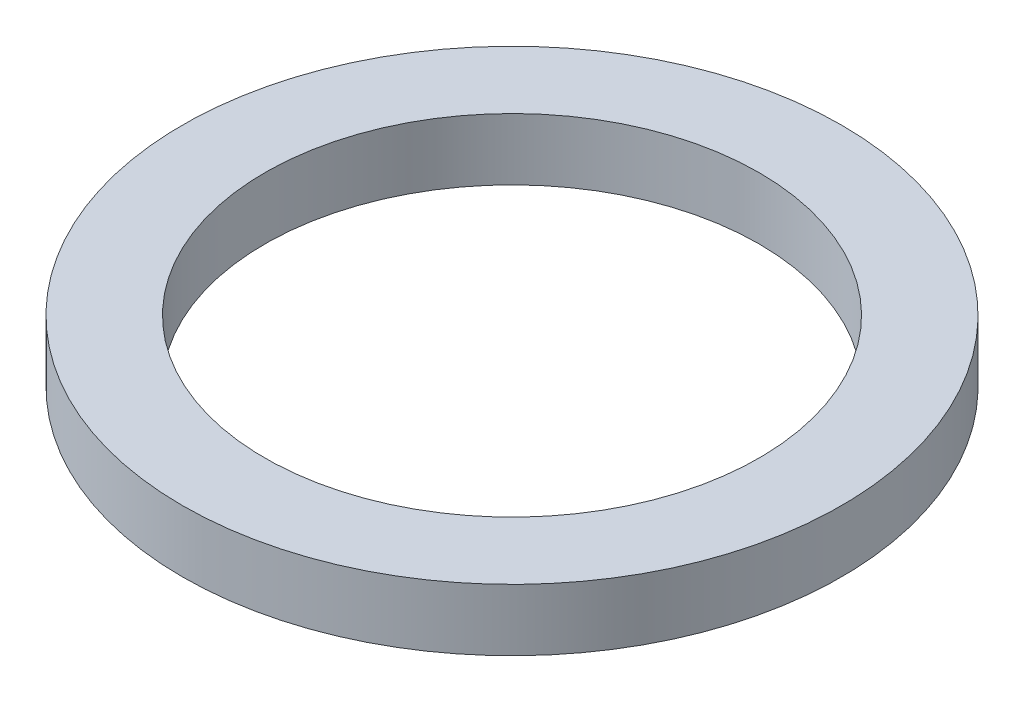
ISO-10303-21;
HEADER;
FILE_DESCRIPTION(('STEP AP214'),'2;1');
FILE_NAME('part.step','',(''),(''),'','','');
FILE_SCHEMA(('AUTOMOTIVE_DESIGN { 1 0 10303 214 1 1 1 1 }'));
ENDSEC;
DATA;
#1=APPLICATION_CONTEXT('core data for automotive mechanical design processes');
#2=APPLICATION_PROTOCOL_DEFINITION('international standard','automotive_design',2000,#1);
#3=PRODUCT_CONTEXT('',#1,'mechanical');
#4=PRODUCT('Part','Part','',(#3));
#5=PRODUCT_RELATED_PRODUCT_CATEGORY('part','',(#4));
#6=PRODUCT_DEFINITION_FORMATION('','',#4);
#7=PRODUCT_DEFINITION_CONTEXT('part definition',#1,'design');
#8=PRODUCT_DEFINITION('design','',#6,#7);
#9=PRODUCT_DEFINITION_SHAPE('','',#8);
#10=(LENGTH_UNIT() NAMED_UNIT(*) SI_UNIT(.MILLI.,.METRE.));
#11=(NAMED_UNIT(*) PLANE_ANGLE_UNIT() SI_UNIT($,.RADIAN.));
#12=(NAMED_UNIT(*) SI_UNIT($,.STERADIAN.) SOLID_ANGLE_UNIT());
#13=UNCERTAINTY_MEASURE_WITH_UNIT(LENGTH_MEASURE(1.E-05),#10,'distance_accuracy_value','');
#14=(GEOMETRIC_REPRESENTATION_CONTEXT(3) GLOBAL_UNCERTAINTY_ASSIGNED_CONTEXT((#13)) GLOBAL_UNIT_ASSIGNED_CONTEXT((#10,
#11,#12)) REPRESENTATION_CONTEXT('',''));
#15=CARTESIAN_POINT('',(0.,0.,0.));
#16=DIRECTION('',(0.,0.,1.));
#17=DIRECTION('',(1.,0.,0.));
#18=AXIS2_PLACEMENT_3D('',#15,#16,#17);
#19=CARTESIAN_POINT('',(-16.,0.,0.));
#20=DIRECTION('',(0.,-1.,0.));
#21=DIRECTION('',(0.,0.,-1.));
#22=AXIS2_PLACEMENT_3D('',#19,#20,#21);
#23=CYLINDRICAL_SURFACE('',#22,16.);
#24=CARTESIAN_POINT('',(-16.,3.,0.));
#25=DIRECTION('',(0.,-1.,0.));
#26=DIRECTION('',(0.,0.,-1.));
#27=AXIS2_PLACEMENT_3D('',#24,#25,#26);
#28=CIRCLE('',#27,16.);
#29=CARTESIAN_POINT('',(-16.,3.,-16.));
#30=VERTEX_POINT('',#29);
#31=EDGE_CURVE('E17',#30,#30,#28,.F.);
#32=ORIENTED_EDGE('',*,*,#31,.F.);
#33=EDGE_LOOP('',(#32));
#34=FACE_BOUND('',#33,.T.);
#35=CARTESIAN_POINT('',(-16.,0.,0.));
#36=DIRECTION('',(0.,-1.,0.));
#37=DIRECTION('',(0.,0.,-1.));
#38=AXIS2_PLACEMENT_3D('',#35,#36,#37);
#39=CIRCLE('',#38,16.);
#40=CARTESIAN_POINT('',(-16.,0.,-16.));
#41=VERTEX_POINT('',#40);
#42=EDGE_CURVE('E26',#41,#41,#39,.T.);
#43=ORIENTED_EDGE('',*,*,#42,.F.);
#44=EDGE_LOOP('',(#43));
#45=FACE_BOUND('',#44,.T.);
#46=ADVANCED_FACE('F14',(#34,#45),#23,.T.);
#47=CARTESIAN_POINT('',(-4.,3.,0.));
#48=DIRECTION('',(0.,-1.,0.));
#49=DIRECTION('',(0.,0.,-1.));
#50=AXIS2_PLACEMENT_3D('',#47,#48,#49);
#51=PLANE('',#50);
#52=CARTESIAN_POINT('',(-16.,3.,0.));
#53=DIRECTION('',(0.,-1.,0.));
#54=DIRECTION('',(0.,0.,-1.));
#55=AXIS2_PLACEMENT_3D('',#52,#53,#54);
#56=CIRCLE('',#55,12.);
#57=CARTESIAN_POINT('',(-16.,3.,-12.));
#58=VERTEX_POINT('',#57);
#59=EDGE_CURVE('E21',#58,#58,#56,.F.);
#60=ORIENTED_EDGE('',*,*,#59,.F.);
#61=EDGE_LOOP('',(#60));
#62=FACE_BOUND('',#61,.T.);
#63=ORIENTED_EDGE('',*,*,#31,.T.);
#64=EDGE_LOOP('',(#63));
#65=FACE_BOUND('',#64,.T.);
#66=ADVANCED_FACE('F34',(#62,#65),#51,.F.);
#67=CARTESIAN_POINT('',(0.,0.,0.));
#68=DIRECTION('',(0.,1.,0.));
#69=DIRECTION('',(0.,0.,1.));
#70=AXIS2_PLACEMENT_3D('',#67,#68,#69);
#71=PLANE('',#70);
#72=CARTESIAN_POINT('',(-16.,0.,0.));
#73=DIRECTION('',(0.,-1.,0.));
#74=DIRECTION('',(0.,0.,-1.));
#75=AXIS2_PLACEMENT_3D('',#72,#73,#74);
#76=CIRCLE('',#75,12.);
#77=CARTESIAN_POINT('',(-16.,0.,-12.));
#78=VERTEX_POINT('',#77);
#79=EDGE_CURVE('E10',#78,#78,#76,.T.);
#80=ORIENTED_EDGE('',*,*,#79,.F.);
#81=EDGE_LOOP('',(#80));
#82=FACE_BOUND('',#81,.T.);
#83=ORIENTED_EDGE('',*,*,#42,.T.);
#84=EDGE_LOOP('',(#83));
#85=FACE_BOUND('',#84,.T.);
#86=ADVANCED_FACE('F42',(#82,#85),#71,.F.);
#87=CARTESIAN_POINT('',(-16.,3.,0.));
#88=DIRECTION('',(0.,-1.,0.));
#89=DIRECTION('',(0.,0.,-1.));
#90=AXIS2_PLACEMENT_3D('',#87,#88,#89);
#91=CYLINDRICAL_SURFACE('',#90,12.);
#92=ORIENTED_EDGE('',*,*,#79,.T.);
#93=EDGE_LOOP('',(#92));
#94=FACE_BOUND('',#93,.T.);
#95=ORIENTED_EDGE('',*,*,#59,.T.);
#96=EDGE_LOOP('',(#95));
#97=FACE_BOUND('',#96,.T.);
#98=ADVANCED_FACE('F44',(#94,#97),#91,.F.);
#99=CLOSED_SHELL('',(#46,#66,#86,#98));
#100=MANIFOLD_SOLID_BREP('B1',#99);
#101=ADVANCED_BREP_SHAPE_REPRESENTATION('',(#18,#100),#14);
#102=SHAPE_DEFINITION_REPRESENTATION(#9,#101);
ENDSEC;
END-ISO-10303-21;
